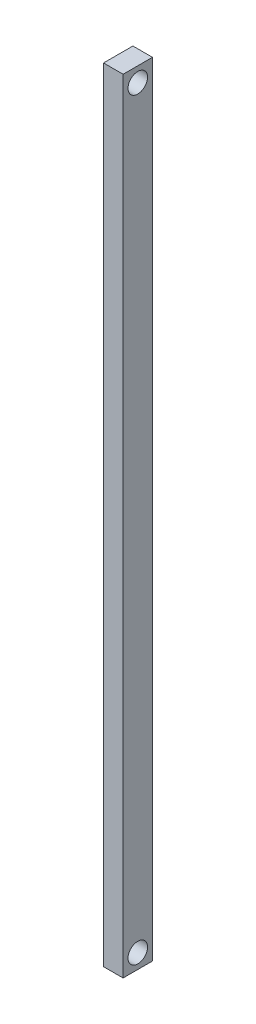
ISO-10303-21;
HEADER;
FILE_DESCRIPTION(('STEP AP214'),'2;1');
FILE_NAME('part.step','',(''),(''),'','','');
FILE_SCHEMA(('AUTOMOTIVE_DESIGN { 1 0 10303 214 1 1 1 1 }'));
ENDSEC;
DATA;
#1=APPLICATION_CONTEXT('core data for automotive mechanical design processes');
#2=APPLICATION_PROTOCOL_DEFINITION('international standard','automotive_design',2000,#1);
#3=PRODUCT_CONTEXT('',#1,'mechanical');
#4=PRODUCT('Part','Part','',(#3));
#5=PRODUCT_RELATED_PRODUCT_CATEGORY('part','',(#4));
#6=PRODUCT_DEFINITION_FORMATION('','',#4);
#7=PRODUCT_DEFINITION_CONTEXT('part definition',#1,'design');
#8=PRODUCT_DEFINITION('design','',#6,#7);
#9=PRODUCT_DEFINITION_SHAPE('','',#8);
#10=(LENGTH_UNIT() NAMED_UNIT(*) SI_UNIT(.MILLI.,.METRE.));
#11=(NAMED_UNIT(*) PLANE_ANGLE_UNIT() SI_UNIT($,.RADIAN.));
#12=(NAMED_UNIT(*) SI_UNIT($,.STERADIAN.) SOLID_ANGLE_UNIT());
#13=UNCERTAINTY_MEASURE_WITH_UNIT(LENGTH_MEASURE(1.E-05),#10,'distance_accuracy_value','');
#14=(GEOMETRIC_REPRESENTATION_CONTEXT(3) GLOBAL_UNCERTAINTY_ASSIGNED_CONTEXT((#13)) GLOBAL_UNIT_ASSIGNED_CONTEXT((#10,
#11,#12)) REPRESENTATION_CONTEXT('',''));
#15=CARTESIAN_POINT('',(0.,0.,0.));
#16=DIRECTION('',(0.,0.,1.));
#17=DIRECTION('',(1.,0.,0.));
#18=AXIS2_PLACEMENT_3D('',#15,#16,#17);
#19=CARTESIAN_POINT('',(10.,0.,15.));
#20=DIRECTION('',(0.,1.,0.));
#21=DIRECTION('',(0.,0.,1.));
#22=AXIS2_PLACEMENT_3D('',#19,#20,#21);
#23=PLANE('',#22);
#24=DIRECTION('',(0.,0.,-1.));
#25=VECTOR('',#24,1.);
#26=CARTESIAN_POINT('',(0.,0.,15.));
#27=LINE('',#26,#25);
#28=CARTESIAN_POINT('',(0.,0.,15.));
#29=VERTEX_POINT('',#28);
#30=CARTESIAN_POINT('',(0.,0.,0.));
#31=VERTEX_POINT('',#30);
#32=EDGE_CURVE('E107',#29,#31,#27,.T.);
#33=ORIENTED_EDGE('',*,*,#32,.T.);
#34=DIRECTION('',(-1.,0.,0.));
#35=VECTOR('',#34,1.);
#36=CARTESIAN_POINT('',(10.,0.,0.));
#37=LINE('',#36,#35);
#38=CARTESIAN_POINT('',(10.,0.,0.));
#39=VERTEX_POINT('',#38);
#40=EDGE_CURVE('E11',#39,#31,#37,.T.);
#41=ORIENTED_EDGE('',*,*,#40,.F.);
#42=DIRECTION('',(0.,0.,-1.));
#43=VECTOR('',#42,1.);
#44=CARTESIAN_POINT('',(10.,0.,15.));
#45=LINE('',#44,#43);
#46=CARTESIAN_POINT('',(10.,0.,15.));
#47=VERTEX_POINT('',#46);
#48=EDGE_CURVE('E96',#47,#39,#45,.T.);
#49=ORIENTED_EDGE('',*,*,#48,.F.);
#50=DIRECTION('',(-1.,0.,0.));
#51=VECTOR('',#50,1.);
#52=CARTESIAN_POINT('',(10.,0.,15.));
#53=LINE('',#52,#51);
#54=EDGE_CURVE('E102',#47,#29,#53,.T.);
#55=ORIENTED_EDGE('',*,*,#54,.T.);
#56=EDGE_LOOP('',(#33,#41,#49,#55));
#57=FACE_BOUND('',#56,.T.);
#58=ADVANCED_FACE('F44',(#57),#23,.F.);
#59=CARTESIAN_POINT('',(10.,0.,0.));
#60=DIRECTION('',(0.,0.,1.));
#61=DIRECTION('',(0.,-1.,0.));
#62=AXIS2_PLACEMENT_3D('',#59,#60,#61);
#63=PLANE('',#62);
#64=DIRECTION('',(0.,1.,0.));
#65=VECTOR('',#64,1.);
#66=CARTESIAN_POINT('',(0.,0.,0.));
#67=LINE('',#66,#65);
#68=CARTESIAN_POINT('',(0.,400.,0.));
#69=VERTEX_POINT('',#68);
#70=EDGE_CURVE('E99',#31,#69,#67,.T.);
#71=ORIENTED_EDGE('',*,*,#70,.T.);
#72=DIRECTION('',(-1.,0.,0.));
#73=VECTOR('',#72,1.);
#74=CARTESIAN_POINT('',(10.,400.,0.));
#75=LINE('',#74,#73);
#76=CARTESIAN_POINT('',(10.,400.,0.));
#77=VERTEX_POINT('',#76);
#78=EDGE_CURVE('E52',#77,#69,#75,.T.);
#79=ORIENTED_EDGE('',*,*,#78,.F.);
#80=DIRECTION('',(0.,1.,0.));
#81=VECTOR('',#80,1.);
#82=CARTESIAN_POINT('',(10.,0.,0.));
#83=LINE('',#82,#81);
#84=EDGE_CURVE('E93',#39,#77,#83,.T.);
#85=ORIENTED_EDGE('',*,*,#84,.F.);
#86=ORIENTED_EDGE('',*,*,#40,.T.);
#87=EDGE_LOOP('',(#71,#79,#85,#86));
#88=FACE_BOUND('',#87,.T.);
#89=ADVANCED_FACE('F97',(#88),#63,.F.);
#90=CARTESIAN_POINT('',(10.,400.,0.));
#91=DIRECTION('',(0.,-1.,0.));
#92=DIRECTION('',(0.,0.,-1.));
#93=AXIS2_PLACEMENT_3D('',#90,#91,#92);
#94=PLANE('',#93);
#95=DIRECTION('',(0.,0.,1.));
#96=VECTOR('',#95,1.);
#97=CARTESIAN_POINT('',(0.,400.,0.));
#98=LINE('',#97,#96);
#99=CARTESIAN_POINT('',(0.,400.,15.0000000000001));
#100=VERTEX_POINT('',#99);
#101=EDGE_CURVE('E79',#69,#100,#98,.T.);
#102=ORIENTED_EDGE('',*,*,#101,.T.);
#103=DIRECTION('',(-1.,0.,0.));
#104=VECTOR('',#103,1.);
#105=CARTESIAN_POINT('',(10.,400.,15.0000000000001));
#106=LINE('',#105,#104);
#107=CARTESIAN_POINT('',(10.,400.,15.0000000000001));
#108=VERTEX_POINT('',#107);
#109=EDGE_CURVE('E101',#108,#100,#106,.T.);
#110=ORIENTED_EDGE('',*,*,#109,.F.);
#111=DIRECTION('',(0.,0.,1.));
#112=VECTOR('',#111,1.);
#113=CARTESIAN_POINT('',(10.,400.,0.));
#114=LINE('',#113,#112);
#115=EDGE_CURVE('E94',#77,#108,#114,.T.);
#116=ORIENTED_EDGE('',*,*,#115,.F.);
#117=ORIENTED_EDGE('',*,*,#78,.T.);
#118=EDGE_LOOP('',(#102,#110,#116,#117));
#119=FACE_BOUND('',#118,.T.);
#120=ADVANCED_FACE('F105',(#119),#94,.F.);
#121=CARTESIAN_POINT('',(10.,400.,15.0000000000001));
#122=DIRECTION('',(0.,0.,-1.));
#123=DIRECTION('',(0.,1.,0.));
#124=AXIS2_PLACEMENT_3D('',#121,#122,#123);
#125=PLANE('',#124);
#126=DIRECTION('',(0.,-1.,0.));
#127=VECTOR('',#126,1.);
#128=CARTESIAN_POINT('',(0.,400.,15.0000000000001));
#129=LINE('',#128,#127);
#130=EDGE_CURVE('E85',#100,#29,#129,.T.);
#131=ORIENTED_EDGE('',*,*,#130,.T.);
#132=ORIENTED_EDGE('',*,*,#54,.F.);
#133=DIRECTION('',(0.,-1.,0.));
#134=VECTOR('',#133,1.);
#135=CARTESIAN_POINT('',(10.,400.,15.0000000000001));
#136=LINE('',#135,#134);
#137=EDGE_CURVE('E62',#108,#47,#136,.T.);
#138=ORIENTED_EDGE('',*,*,#137,.F.);
#139=ORIENTED_EDGE('',*,*,#109,.T.);
#140=EDGE_LOOP('',(#131,#132,#138,#139));
#141=FACE_BOUND('',#140,.T.);
#142=ADVANCED_FACE('F117',(#141),#125,.F.);
#143=CARTESIAN_POINT('',(10.,0.,0.));
#144=DIRECTION('',(1.,0.,0.));
#145=DIRECTION('',(0.,0.,-1.));
#146=AXIS2_PLACEMENT_3D('',#143,#144,#145);
#147=PLANE('',#146);
#148=CARTESIAN_POINT('',(10.,392.5,7.50000000000007));
#149=DIRECTION('',(1.,0.,0.));
#150=DIRECTION('',(0.,0.,-1.));
#151=AXIS2_PLACEMENT_3D('',#148,#149,#150);
#152=CIRCLE('',#151,4.99999999999999);
#153=CARTESIAN_POINT('',(10.,392.5,2.50000000000008));
#154=VERTEX_POINT('',#153);
#155=EDGE_CURVE('E126',#154,#154,#152,.T.);
#156=ORIENTED_EDGE('',*,*,#155,.F.);
#157=EDGE_LOOP('',(#156));
#158=FACE_BOUND('',#157,.T.);
#159=CARTESIAN_POINT('',(10.,7.50000000000002,7.50000000000007));
#160=DIRECTION('',(1.,0.,0.));
#161=DIRECTION('',(0.,0.,-1.));
#162=AXIS2_PLACEMENT_3D('',#159,#160,#161);
#163=CIRCLE('',#162,5.);
#164=CARTESIAN_POINT('',(10.,7.50000000000002,2.50000000000007));
#165=VERTEX_POINT('',#164);
#166=EDGE_CURVE('E112',#165,#165,#163,.T.);
#167=ORIENTED_EDGE('',*,*,#166,.F.);
#168=EDGE_LOOP('',(#167));
#169=FACE_BOUND('',#168,.T.);
#170=ORIENTED_EDGE('',*,*,#48,.T.);
#171=ORIENTED_EDGE('',*,*,#84,.T.);
#172=ORIENTED_EDGE('',*,*,#115,.T.);
#173=ORIENTED_EDGE('',*,*,#137,.T.);
#174=EDGE_LOOP('',(#170,#171,#172,#173));
#175=FACE_BOUND('',#174,.T.);
#176=ADVANCED_FACE('F95',(#158,#169,#175),#147,.T.);
#177=CARTESIAN_POINT('',(0.,0.,0.));
#178=DIRECTION('',(1.,0.,0.));
#179=DIRECTION('',(0.,0.,-1.));
#180=AXIS2_PLACEMENT_3D('',#177,#178,#179);
#181=PLANE('',#180);
#182=CARTESIAN_POINT('',(0.,392.5,7.50000000000007));
#183=DIRECTION('',(1.,0.,0.));
#184=DIRECTION('',(0.,0.,-1.));
#185=AXIS2_PLACEMENT_3D('',#182,#183,#184);
#186=CIRCLE('',#185,4.99999999999999);
#187=CARTESIAN_POINT('',(0.,392.5,2.50000000000008));
#188=VERTEX_POINT('',#187);
#189=EDGE_CURVE('E121',#188,#188,#186,.T.);
#190=ORIENTED_EDGE('',*,*,#189,.T.);
#191=EDGE_LOOP('',(#190));
#192=FACE_BOUND('',#191,.T.);
#193=CARTESIAN_POINT('',(0.,7.50000000000002,7.50000000000007));
#194=DIRECTION('',(1.,0.,0.));
#195=DIRECTION('',(0.,0.,-1.));
#196=AXIS2_PLACEMENT_3D('',#193,#194,#195);
#197=CIRCLE('',#196,5.);
#198=CARTESIAN_POINT('',(0.,7.50000000000002,2.50000000000007));
#199=VERTEX_POINT('',#198);
#200=EDGE_CURVE('E124',#199,#199,#197,.T.);
#201=ORIENTED_EDGE('',*,*,#200,.T.);
#202=EDGE_LOOP('',(#201));
#203=FACE_BOUND('',#202,.T.);
#204=ORIENTED_EDGE('',*,*,#32,.F.);
#205=ORIENTED_EDGE('',*,*,#130,.F.);
#206=ORIENTED_EDGE('',*,*,#101,.F.);
#207=ORIENTED_EDGE('',*,*,#70,.F.);
#208=EDGE_LOOP('',(#204,#205,#206,#207));
#209=FACE_BOUND('',#208,.T.);
#210=ADVANCED_FACE('F116',(#192,#203,#209),#181,.F.);
#211=CARTESIAN_POINT('',(10.,7.50000000000002,7.50000000000007));
#212=DIRECTION('',(-1.,0.,0.));
#213=DIRECTION('',(0.,0.,1.));
#214=AXIS2_PLACEMENT_3D('',#211,#212,#213);
#215=CYLINDRICAL_SURFACE('',#214,5.);
#216=ORIENTED_EDGE('',*,*,#166,.T.);
#217=EDGE_LOOP('',(#216));
#218=FACE_BOUND('',#217,.T.);
#219=ORIENTED_EDGE('',*,*,#200,.F.);
#220=EDGE_LOOP('',(#219));
#221=FACE_BOUND('',#220,.T.);
#222=ADVANCED_FACE('F140',(#218,#221),#215,.F.);
#223=CARTESIAN_POINT('',(0.,392.5,7.50000000000007));
#224=DIRECTION('',(1.,0.,0.));
#225=DIRECTION('',(0.,0.,-1.));
#226=AXIS2_PLACEMENT_3D('',#223,#224,#225);
#227=CYLINDRICAL_SURFACE('',#226,4.99999999999999);
#228=ORIENTED_EDGE('',*,*,#189,.F.);
#229=EDGE_LOOP('',(#228));
#230=FACE_BOUND('',#229,.T.);
#231=ORIENTED_EDGE('',*,*,#155,.T.);
#232=EDGE_LOOP('',(#231));
#233=FACE_BOUND('',#232,.T.);
#234=ADVANCED_FACE('F138',(#230,#233),#227,.F.);
#235=CLOSED_SHELL('',(#58,#89,#120,#142,#176,#210,#222,#234));
#236=MANIFOLD_SOLID_BREP('B2',#235);
#237=ADVANCED_BREP_SHAPE_REPRESENTATION('',(#18,#236),#14);
#238=SHAPE_DEFINITION_REPRESENTATION(#9,#237);
ENDSEC;
END-ISO-10303-21;
